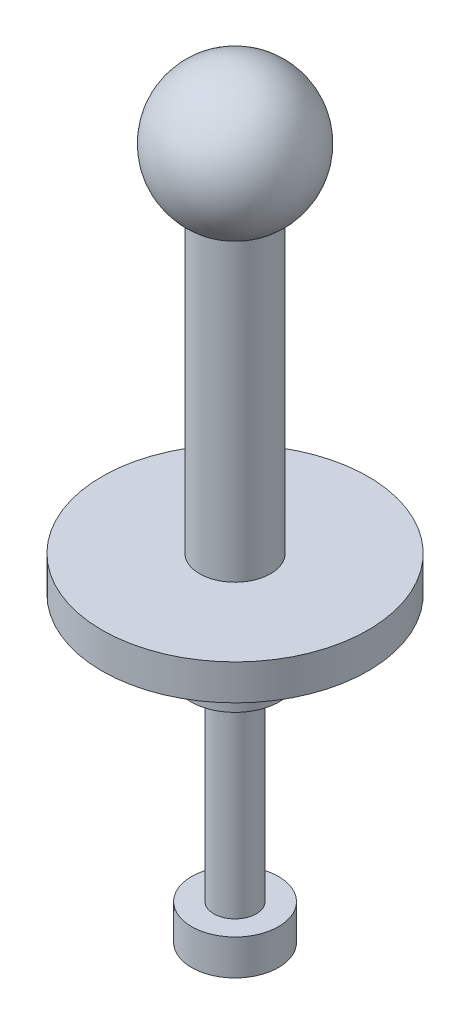
ISO-10303-21;
HEADER;
FILE_DESCRIPTION(('STEP AP214'),'2;1');
FILE_NAME('part.step','',(''),(''),'','','');
FILE_SCHEMA(('AUTOMOTIVE_DESIGN { 1 0 10303 214 1 1 1 1 }'));
ENDSEC;
DATA;
#1=APPLICATION_CONTEXT('core data for automotive mechanical design processes');
#2=APPLICATION_PROTOCOL_DEFINITION('international standard','automotive_design',2000,#1);
#3=PRODUCT_CONTEXT('',#1,'mechanical');
#4=PRODUCT('Part','Part','',(#3));
#5=PRODUCT_RELATED_PRODUCT_CATEGORY('part','',(#4));
#6=PRODUCT_DEFINITION_FORMATION('','',#4);
#7=PRODUCT_DEFINITION_CONTEXT('part definition',#1,'design');
#8=PRODUCT_DEFINITION('design','',#6,#7);
#9=PRODUCT_DEFINITION_SHAPE('','',#8);
#10=(LENGTH_UNIT() NAMED_UNIT(*) SI_UNIT(.MILLI.,.METRE.));
#11=(NAMED_UNIT(*) PLANE_ANGLE_UNIT() SI_UNIT($,.RADIAN.));
#12=(NAMED_UNIT(*) SI_UNIT($,.STERADIAN.) SOLID_ANGLE_UNIT());
#13=UNCERTAINTY_MEASURE_WITH_UNIT(LENGTH_MEASURE(1.E-05),#10,'distance_accuracy_value','');
#14=(GEOMETRIC_REPRESENTATION_CONTEXT(3) GLOBAL_UNCERTAINTY_ASSIGNED_CONTEXT((#13)) GLOBAL_UNIT_ASSIGNED_CONTEXT((#10,
#11,#12)) REPRESENTATION_CONTEXT('',''));
#15=CARTESIAN_POINT('',(0.,0.,0.));
#16=DIRECTION('',(0.,0.,1.));
#17=DIRECTION('',(1.,0.,0.));
#18=AXIS2_PLACEMENT_3D('',#15,#16,#17);
#19=CARTESIAN_POINT('',(0.,-2.,0.));
#20=DIRECTION('',(0.,1.,0.));
#21=DIRECTION('',(0.,0.,1.));
#22=AXIS2_PLACEMENT_3D('',#19,#20,#21);
#23=CYLINDRICAL_SURFACE('',#22,7.5);
#24=CARTESIAN_POINT('',(0.,-2.,0.));
#25=DIRECTION('',(0.,1.,0.));
#26=DIRECTION('',(0.,0.,1.));
#27=AXIS2_PLACEMENT_3D('',#24,#25,#26);
#28=CIRCLE('',#27,7.5);
#29=CARTESIAN_POINT('',(0.,-2.,7.5));
#30=VERTEX_POINT('',#29);
#31=EDGE_CURVE('E10',#30,#30,#28,.T.);
#32=ORIENTED_EDGE('',*,*,#31,.T.);
#33=EDGE_LOOP('',(#32));
#34=FACE_BOUND('',#33,.T.);
#35=CARTESIAN_POINT('',(0.,0.,0.));
#36=DIRECTION('',(0.,1.,0.));
#37=DIRECTION('',(0.,0.,1.));
#38=AXIS2_PLACEMENT_3D('',#35,#36,#37);
#39=CIRCLE('',#38,7.5);
#40=CARTESIAN_POINT('',(0.,0.,7.5));
#41=VERTEX_POINT('',#40);
#42=EDGE_CURVE('E44',#41,#41,#39,.T.);
#43=ORIENTED_EDGE('',*,*,#42,.F.);
#44=EDGE_LOOP('',(#43));
#45=FACE_BOUND('',#44,.T.);
#46=ADVANCED_FACE('F41',(#34,#45),#23,.T.);
#47=CARTESIAN_POINT('',(0.,-2.,0.));
#48=DIRECTION('',(0.,1.,0.));
#49=DIRECTION('',(0.,0.,1.));
#50=AXIS2_PLACEMENT_3D('',#47,#48,#49);
#51=PLANE('',#50);
#52=CARTESIAN_POINT('',(0.,-2.,0.));
#53=DIRECTION('',(0.,1.,0.));
#54=DIRECTION('',(-1.,0.,0.));
#55=AXIS2_PLACEMENT_3D('',#52,#53,#54);
#56=CIRCLE('',#55,4.);
#57=CARTESIAN_POINT('',(-4.,-2.,0.));
#58=VERTEX_POINT('',#57);
#59=EDGE_CURVE('E51',#58,#58,#56,.T.);
#60=ORIENTED_EDGE('',*,*,#59,.T.);
#61=EDGE_LOOP('',(#60));
#62=FACE_BOUND('',#61,.T.);
#63=ORIENTED_EDGE('',*,*,#31,.F.);
#64=EDGE_LOOP('',(#63));
#65=FACE_BOUND('',#64,.T.);
#66=ADVANCED_FACE('F101',(#62,#65),#51,.F.);
#67=CARTESIAN_POINT('',(0.,0.,0.));
#68=DIRECTION('',(0.,1.,0.));
#69=DIRECTION('',(0.,0.,1.));
#70=AXIS2_PLACEMENT_3D('',#67,#68,#69);
#71=PLANE('',#70);
#72=CARTESIAN_POINT('',(0.,0.,0.));
#73=DIRECTION('',(0.,-1.,0.));
#74=DIRECTION('',(0.,0.,-1.));
#75=AXIS2_PLACEMENT_3D('',#72,#73,#74);
#76=CIRCLE('',#75,2.);
#77=CARTESIAN_POINT('',(0.,0.,-2.));
#78=VERTEX_POINT('',#77);
#79=EDGE_CURVE('E82',#78,#78,#76,.T.);
#80=ORIENTED_EDGE('',*,*,#79,.T.);
#81=EDGE_LOOP('',(#80));
#82=FACE_BOUND('',#81,.T.);
#83=ORIENTED_EDGE('',*,*,#42,.T.);
#84=EDGE_LOOP('',(#83));
#85=FACE_BOUND('',#84,.T.);
#86=ADVANCED_FACE('F86',(#82,#85),#71,.T.);
#87=CARTESIAN_POINT('',(0.,-4.,0.));
#88=DIRECTION('',(0.,1.,0.));
#89=DIRECTION('',(-1.,0.,0.));
#90=AXIS2_PLACEMENT_3D('',#87,#88,#89);
#91=CONICAL_SURFACE('',#90,1.2,0.950546840812076);
#92=CARTESIAN_POINT('',(0.,-4.,0.));
#93=DIRECTION('',(0.,1.,0.));
#94=DIRECTION('',(-1.,0.,0.));
#95=AXIS2_PLACEMENT_3D('',#92,#93,#94);
#96=CIRCLE('',#95,1.2);
#97=CARTESIAN_POINT('',(-1.2,-4.,0.));
#98=VERTEX_POINT('',#97);
#99=EDGE_CURVE('E55',#98,#98,#96,.T.);
#100=CARTESIAN_POINT('',(-4.,-2.,0.));
#101=CARTESIAN_POINT('',(-3.97083333333333,-2.02083333333333,0.));
#102=CARTESIAN_POINT('',(-3.94166666666667,-2.04166666666667,0.));
#103=CARTESIAN_POINT('',(-3.88333333333333,-2.08333333333334,0.));
#104=CARTESIAN_POINT('',(-3.85416666666667,-2.10416666666667,0.));
#105=CARTESIAN_POINT('',(-3.79583333333333,-2.14583333333334,0.));
#106=CARTESIAN_POINT('',(-3.76666666666667,-2.16666666666667,0.));
#107=CARTESIAN_POINT('',(-3.70833333333333,-2.20833333333334,0.));
#108=CARTESIAN_POINT('',(-3.67916666666667,-2.22916666666667,0.));
#109=CARTESIAN_POINT('',(-3.62083333333333,-2.27083333333334,0.));
#110=CARTESIAN_POINT('',(-3.59166666666667,-2.29166666666667,0.));
#111=CARTESIAN_POINT('',(-3.53333333333333,-2.33333333333333,0.));
#112=CARTESIAN_POINT('',(-3.50416666666667,-2.35416666666667,0.));
#113=CARTESIAN_POINT('',(-3.44583333333333,-2.39583333333333,0.));
#114=CARTESIAN_POINT('',(-3.41666666666667,-2.41666666666667,0.));
#115=CARTESIAN_POINT('',(-3.35833333333333,-2.45833333333333,0.));
#116=CARTESIAN_POINT('',(-3.32916666666667,-2.47916666666667,0.));
#117=CARTESIAN_POINT('',(-3.27083333333333,-2.52083333333333,0.));
#118=CARTESIAN_POINT('',(-3.24166666666667,-2.54166666666667,0.));
#119=CARTESIAN_POINT('',(-3.18333333333333,-2.58333333333333,0.));
#120=CARTESIAN_POINT('',(-3.15416666666667,-2.60416666666667,0.));
#121=CARTESIAN_POINT('',(-3.09583333333333,-2.64583333333333,0.));
#122=CARTESIAN_POINT('',(-3.06666666666667,-2.66666666666667,0.));
#123=CARTESIAN_POINT('',(-3.00833333333333,-2.70833333333333,0.));
#124=CARTESIAN_POINT('',(-2.97916666666667,-2.72916666666667,0.));
#125=CARTESIAN_POINT('',(-2.92083333333333,-2.77083333333333,0.));
#126=CARTESIAN_POINT('',(-2.89166666666667,-2.79166666666667,0.));
#127=CARTESIAN_POINT('',(-2.83333333333333,-2.83333333333333,0.));
#128=CARTESIAN_POINT('',(-2.80416666666667,-2.85416666666667,0.));
#129=CARTESIAN_POINT('',(-2.74583333333333,-2.89583333333333,0.));
#130=CARTESIAN_POINT('',(-2.71666666666667,-2.91666666666667,0.));
#131=CARTESIAN_POINT('',(-2.65833333333333,-2.95833333333333,0.));
#132=CARTESIAN_POINT('',(-2.62916666666667,-2.97916666666667,0.));
#133=CARTESIAN_POINT('',(-2.57083333333333,-3.02083333333333,0.));
#134=CARTESIAN_POINT('',(-2.54166666666667,-3.04166666666667,0.));
#135=CARTESIAN_POINT('',(-2.48333333333333,-3.08333333333333,0.));
#136=CARTESIAN_POINT('',(-2.45416666666667,-3.10416666666667,0.));
#137=CARTESIAN_POINT('',(-2.39583333333333,-3.14583333333333,0.));
#138=CARTESIAN_POINT('',(-2.36666666666667,-3.16666666666667,0.));
#139=CARTESIAN_POINT('',(-2.30833333333333,-3.20833333333333,0.));
#140=CARTESIAN_POINT('',(-2.27916666666667,-3.22916666666667,0.));
#141=CARTESIAN_POINT('',(-2.22083333333333,-3.27083333333333,0.));
#142=CARTESIAN_POINT('',(-2.19166666666667,-3.29166666666667,0.));
#143=CARTESIAN_POINT('',(-2.13333333333333,-3.33333333333333,0.));
#144=CARTESIAN_POINT('',(-2.10416666666667,-3.35416666666667,0.));
#145=CARTESIAN_POINT('',(-2.04583333333333,-3.39583333333333,0.));
#146=CARTESIAN_POINT('',(-2.01666666666667,-3.41666666666667,0.));
#147=CARTESIAN_POINT('',(-1.95833333333333,-3.45833333333333,0.));
#148=CARTESIAN_POINT('',(-1.92916666666667,-3.47916666666667,0.));
#149=CARTESIAN_POINT('',(-1.87083333333333,-3.52083333333333,0.));
#150=CARTESIAN_POINT('',(-1.84166666666667,-3.54166666666667,0.));
#151=CARTESIAN_POINT('',(-1.78333333333333,-3.58333333333333,0.));
#152=CARTESIAN_POINT('',(-1.75416666666667,-3.60416666666667,0.));
#153=CARTESIAN_POINT('',(-1.69583333333333,-3.64583333333333,0.));
#154=CARTESIAN_POINT('',(-1.66666666666667,-3.66666666666667,0.));
#155=CARTESIAN_POINT('',(-1.60833333333333,-3.70833333333333,0.));
#156=CARTESIAN_POINT('',(-1.57916666666667,-3.72916666666667,0.));
#157=CARTESIAN_POINT('',(-1.52083333333333,-3.77083333333333,0.));
#158=CARTESIAN_POINT('',(-1.49166666666667,-3.79166666666667,0.));
#159=CARTESIAN_POINT('',(-1.43333333333333,-3.83333333333333,0.));
#160=CARTESIAN_POINT('',(-1.40416666666667,-3.85416666666667,0.));
#161=CARTESIAN_POINT('',(-1.34583333333333,-3.89583333333333,0.));
#162=CARTESIAN_POINT('',(-1.31666666666667,-3.91666666666667,0.));
#163=CARTESIAN_POINT('',(-1.25833333333333,-3.95833333333333,0.));
#164=CARTESIAN_POINT('',(-1.22916666666667,-3.97916666666667,0.));
#165=CARTESIAN_POINT('',(-1.2,-4.,0.));
#166=B_SPLINE_CURVE_WITH_KNOTS('',3,(#100,#101,#102,#103,#104,#105,#106,#107,#108,#109,#110,
#111,#112,#113,#114,#115,#116,#117,#118,#119,#120,#121,#122,#123,#124,#125,#126,#127,#128,#129,
#130,#131,#132,#133,#134,#135,#136,#137,#138,#139,#140,#141,#142,#143,#144,#145,#146,#147,#148,
#149,#150,#151,#152,#153,#154,#155,#156,#157,#158,#159,#160,#161,#162,#163,#164,#165),
.UNSPECIFIED.,.F.,.F.,(4,2,2,2,2,2,2,2,2,2,2,2,2,2,2,2,2,2,2,2,2,2,2,2,2,2,2,2,2,2,2,2,4),(0.,
0.107529065838033,0.215058131676066,0.322587197514099,0.430116263352132,0.537645329190165,
0.645174395028197,0.75270346086623,0.860232526704263,0.967761592542296,1.07529065838033,
1.18281972421836,1.29034879005639,1.39787785589443,1.50540692173246,1.61293598757049,
1.72046505340853,1.82799411924656,1.93552318508459,2.04305225092262,2.15058131676066,
2.25811038259869,2.36563944843672,2.47316851427476,2.58069758011279,2.68822664595082,
2.79575571178885,2.90328477762689,3.01081384346492,3.11834290930295,3.22587197514099,
3.33340104097902,3.44093010681705),.UNSPECIFIED.);
#167=EDGE_CURVE('BSEAM110',#58,#98,#166,.T.);
#168=ORIENTED_EDGE('',*,*,#59,.F.);
#169=ORIENTED_EDGE('',*,*,#99,.T.);
#170=ORIENTED_EDGE('',*,*,#167,.T.);
#171=ORIENTED_EDGE('',*,*,#167,.F.);
#172=EDGE_LOOP('',(#168,#170,#169,#171));
#173=FACE_BOUND('',#172,.T.);
#174=ADVANCED_FACE('F110',(#173),#91,.T.);
#175=CARTESIAN_POINT('',(0.,-2.,0.));
#176=DIRECTION('',(0.,1.,0.));
#177=DIRECTION('',(-1.,0.,0.));
#178=AXIS2_PLACEMENT_3D('',#175,#176,#177);
#179=CYLINDRICAL_SURFACE('',#178,1.2);
#180=ORIENTED_EDGE('',*,*,#99,.F.);
#181=EDGE_LOOP('',(#180));
#182=FACE_BOUND('',#181,.T.);
#183=CARTESIAN_POINT('',(0.,-4.5,0.));
#184=DIRECTION('',(0.,1.,0.));
#185=DIRECTION('',(-1.,0.,0.));
#186=AXIS2_PLACEMENT_3D('',#183,#184,#185);
#187=CIRCLE('',#186,1.2);
#188=CARTESIAN_POINT('',(-1.2,-4.5,0.));
#189=VERTEX_POINT('',#188);
#190=EDGE_CURVE('E58',#189,#189,#187,.T.);
#191=ORIENTED_EDGE('',*,*,#190,.T.);
#192=EDGE_LOOP('',(#191));
#193=FACE_BOUND('',#192,.T.);
#194=ADVANCED_FACE('F115',(#182,#193),#179,.T.);
#195=CARTESIAN_POINT('',(0.,-4.5,0.));
#196=DIRECTION('',(0.,-1.,0.));
#197=DIRECTION('',(1.,0.,0.));
#198=AXIS2_PLACEMENT_3D('',#195,#196,#197);
#199=PLANE('',#198);
#200=ORIENTED_EDGE('',*,*,#190,.F.);
#201=EDGE_LOOP('',(#200));
#202=FACE_BOUND('',#201,.T.);
#203=CARTESIAN_POINT('',(0.,-4.5,0.));
#204=DIRECTION('',(0.,1.,0.));
#205=DIRECTION('',(-1.,0.,0.));
#206=AXIS2_PLACEMENT_3D('',#203,#204,#205);
#207=CIRCLE('',#206,2.5);
#208=CARTESIAN_POINT('',(-2.5,-4.5,0.));
#209=VERTEX_POINT('',#208);
#210=EDGE_CURVE('E61',#209,#209,#207,.T.);
#211=ORIENTED_EDGE('',*,*,#210,.T.);
#212=EDGE_LOOP('',(#211));
#213=FACE_BOUND('',#212,.T.);
#214=ADVANCED_FACE('F121',(#202,#213),#199,.F.);
#215=CARTESIAN_POINT('',(0.,-2.,0.));
#216=DIRECTION('',(0.,1.,0.));
#217=DIRECTION('',(-1.,0.,0.));
#218=AXIS2_PLACEMENT_3D('',#215,#216,#217);
#219=CYLINDRICAL_SURFACE('',#218,2.5);
#220=ORIENTED_EDGE('',*,*,#210,.F.);
#221=EDGE_LOOP('',(#220));
#222=FACE_BOUND('',#221,.T.);
#223=CARTESIAN_POINT('',(0.,-6.,0.));
#224=DIRECTION('',(0.,1.,0.));
#225=DIRECTION('',(-1.,0.,0.));
#226=AXIS2_PLACEMENT_3D('',#223,#224,#225);
#227=CIRCLE('',#226,2.5);
#228=CARTESIAN_POINT('',(-2.5,-6.,0.));
#229=VERTEX_POINT('',#228);
#230=EDGE_CURVE('E64',#229,#229,#227,.T.);
#231=ORIENTED_EDGE('',*,*,#230,.T.);
#232=EDGE_LOOP('',(#231));
#233=FACE_BOUND('',#232,.T.);
#234=ADVANCED_FACE('F125',(#222,#233),#219,.T.);
#235=CARTESIAN_POINT('',(0.,-6.,0.));
#236=DIRECTION('',(0.,1.,0.));
#237=DIRECTION('',(-1.,0.,0.));
#238=AXIS2_PLACEMENT_3D('',#235,#236,#237);
#239=PLANE('',#238);
#240=ORIENTED_EDGE('',*,*,#230,.F.);
#241=EDGE_LOOP('',(#240));
#242=FACE_BOUND('',#241,.T.);
#243=CARTESIAN_POINT('',(0.,-6.,0.));
#244=DIRECTION('',(0.,1.,0.));
#245=DIRECTION('',(-1.,0.,0.));
#246=AXIS2_PLACEMENT_3D('',#243,#244,#245);
#247=CIRCLE('',#246,1.2);
#248=CARTESIAN_POINT('',(-1.2,-6.,0.));
#249=VERTEX_POINT('',#248);
#250=EDGE_CURVE('E67',#249,#249,#247,.T.);
#251=ORIENTED_EDGE('',*,*,#250,.T.);
#252=EDGE_LOOP('',(#251));
#253=FACE_BOUND('',#252,.T.);
#254=ADVANCED_FACE('F129',(#242,#253),#239,.F.);
#255=CARTESIAN_POINT('',(0.,-2.,0.));
#256=DIRECTION('',(0.,1.,0.));
#257=DIRECTION('',(-1.,0.,0.));
#258=AXIS2_PLACEMENT_3D('',#255,#256,#257);
#259=CYLINDRICAL_SURFACE('',#258,1.2);
#260=ORIENTED_EDGE('',*,*,#250,.F.);
#261=EDGE_LOOP('',(#260));
#262=FACE_BOUND('',#261,.T.);
#263=CARTESIAN_POINT('',(0.,-17.,0.));
#264=DIRECTION('',(0.,1.,0.));
#265=DIRECTION('',(-1.,0.,0.));
#266=AXIS2_PLACEMENT_3D('',#263,#264,#265);
#267=CIRCLE('',#266,1.2);
#268=CARTESIAN_POINT('',(-1.2,-17.,0.));
#269=VERTEX_POINT('',#268);
#270=EDGE_CURVE('E70',#269,#269,#267,.T.);
#271=ORIENTED_EDGE('',*,*,#270,.T.);
#272=EDGE_LOOP('',(#271));
#273=FACE_BOUND('',#272,.T.);
#274=ADVANCED_FACE('F133',(#262,#273),#259,.T.);
#275=CARTESIAN_POINT('',(0.,-17.,0.));
#276=DIRECTION('',(0.,-1.,0.));
#277=DIRECTION('',(1.,0.,0.));
#278=AXIS2_PLACEMENT_3D('',#275,#276,#277);
#279=PLANE('',#278);
#280=ORIENTED_EDGE('',*,*,#270,.F.);
#281=EDGE_LOOP('',(#280));
#282=FACE_BOUND('',#281,.T.);
#283=CARTESIAN_POINT('',(0.,-17.,0.));
#284=DIRECTION('',(0.,1.,0.));
#285=DIRECTION('',(-1.,0.,0.));
#286=AXIS2_PLACEMENT_3D('',#283,#284,#285);
#287=CIRCLE('',#286,2.45);
#288=CARTESIAN_POINT('',(-2.45,-17.,0.));
#289=VERTEX_POINT('',#288);
#290=EDGE_CURVE('E73',#289,#289,#287,.T.);
#291=ORIENTED_EDGE('',*,*,#290,.T.);
#292=EDGE_LOOP('',(#291));
#293=FACE_BOUND('',#292,.T.);
#294=ADVANCED_FACE('F137',(#282,#293),#279,.F.);
#295=CARTESIAN_POINT('',(0.,-2.,0.));
#296=DIRECTION('',(0.,1.,0.));
#297=DIRECTION('',(-1.,0.,0.));
#298=AXIS2_PLACEMENT_3D('',#295,#296,#297);
#299=CYLINDRICAL_SURFACE('',#298,2.45);
#300=ORIENTED_EDGE('',*,*,#290,.F.);
#301=EDGE_LOOP('',(#300));
#302=FACE_BOUND('',#301,.T.);
#303=CARTESIAN_POINT('',(0.,-19.,0.));
#304=DIRECTION('',(0.,1.,0.));
#305=DIRECTION('',(-1.,0.,0.));
#306=AXIS2_PLACEMENT_3D('',#303,#304,#305);
#307=CIRCLE('',#306,2.45);
#308=CARTESIAN_POINT('',(-2.45,-19.,0.));
#309=VERTEX_POINT('',#308);
#310=EDGE_CURVE('E76',#309,#309,#307,.T.);
#311=ORIENTED_EDGE('',*,*,#310,.T.);
#312=EDGE_LOOP('',(#311));
#313=FACE_BOUND('',#312,.T.);
#314=ADVANCED_FACE('F141',(#302,#313),#299,.T.);
#315=CARTESIAN_POINT('',(0.,-19.,0.));
#316=DIRECTION('',(0.,1.,0.));
#317=DIRECTION('',(-1.,0.,0.));
#318=AXIS2_PLACEMENT_3D('',#315,#316,#317);
#319=PLANE('',#318);
#320=ORIENTED_EDGE('',*,*,#310,.F.);
#321=EDGE_LOOP('',(#320));
#322=FACE_BOUND('',#321,.T.);
#323=ADVANCED_FACE('F97',(#322),#319,.F.);
#324=CARTESIAN_POINT('',(0.,20.,0.));
#325=DIRECTION('',(0.,-1.,0.));
#326=DIRECTION('',(0.,0.,1.));
#327=AXIS2_PLACEMENT_3D('',#324,#325,#326);
#328=SPHERICAL_SURFACE('',#327,3.9);
#329=CARTESIAN_POINT('',(0.,16.6518661914434,0.));
#330=DIRECTION('',(0.,-1.,0.));
#331=DIRECTION('',(0.,0.,-1.));
#332=AXIS2_PLACEMENT_3D('',#329,#330,#331);
#333=CIRCLE('',#332,2.);
#334=CARTESIAN_POINT('',(0.,16.6518661914434,-2.));
#335=VERTEX_POINT('',#334);
#336=EDGE_CURVE('E79',#335,#335,#333,.T.);
#337=ORIENTED_EDGE('',*,*,#336,.F.);
#338=EDGE_LOOP('',(#337));
#339=FACE_BOUND('',#338,.T.);
#340=ADVANCED_FACE('F91',(#339),#328,.T.);
#341=CARTESIAN_POINT('',(0.,0.,0.));
#342=DIRECTION('',(0.,-1.,0.));
#343=DIRECTION('',(0.,0.,-1.));
#344=AXIS2_PLACEMENT_3D('',#341,#342,#343);
#345=CYLINDRICAL_SURFACE('',#344,2.);
#346=ORIENTED_EDGE('',*,*,#336,.T.);
#347=EDGE_LOOP('',(#346));
#348=FACE_BOUND('',#347,.T.);
#349=ORIENTED_EDGE('',*,*,#79,.F.);
#350=EDGE_LOOP('',(#349));
#351=FACE_BOUND('',#350,.T.);
#352=ADVANCED_FACE('F89',(#348,#351),#345,.T.);
#353=CLOSED_SHELL('',(#46,#66,#86,#174,#194,#214,#234,#254,#274,#294,#314,#323,#340,#352));
#354=MANIFOLD_SOLID_BREP('B2',#353);
#355=ADVANCED_BREP_SHAPE_REPRESENTATION('',(#18,#354),#14);
#356=SHAPE_DEFINITION_REPRESENTATION(#9,#355);
ENDSEC;
END-ISO-10303-21;
